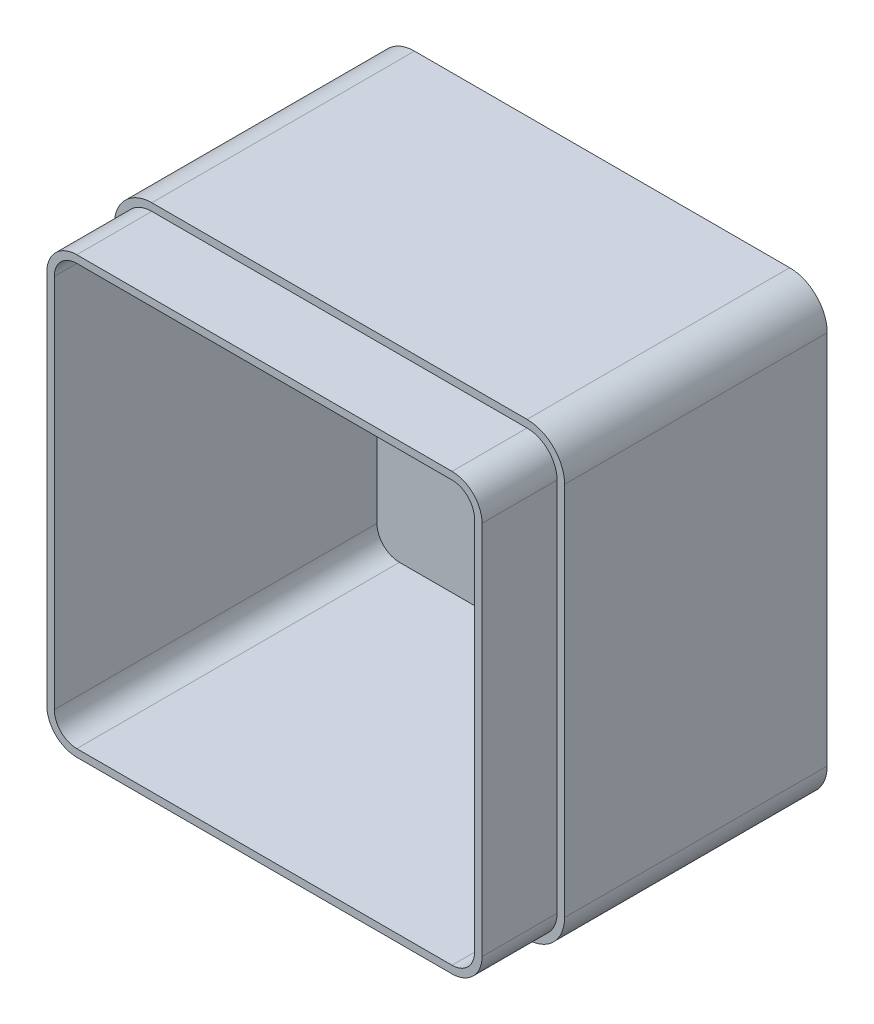
ISO-10303-21;
HEADER;
FILE_DESCRIPTION(('STEP AP214'),'2;1');
FILE_NAME('part.step','',(''),(''),'','','');
FILE_SCHEMA(('AUTOMOTIVE_DESIGN { 1 0 10303 214 1 1 1 1 }'));
ENDSEC;
DATA;
#1=APPLICATION_CONTEXT('core data for automotive mechanical design processes');
#2=APPLICATION_PROTOCOL_DEFINITION('international standard','automotive_design',2000,#1);
#3=PRODUCT_CONTEXT('',#1,'mechanical');
#4=PRODUCT('Part','Part','',(#3));
#5=PRODUCT_RELATED_PRODUCT_CATEGORY('part','',(#4));
#6=PRODUCT_DEFINITION_FORMATION('','',#4);
#7=PRODUCT_DEFINITION_CONTEXT('part definition',#1,'design');
#8=PRODUCT_DEFINITION('design','',#6,#7);
#9=PRODUCT_DEFINITION_SHAPE('','',#8);
#10=(LENGTH_UNIT() NAMED_UNIT(*) SI_UNIT(.MILLI.,.METRE.));
#11=(NAMED_UNIT(*) PLANE_ANGLE_UNIT() SI_UNIT($,.RADIAN.));
#12=(NAMED_UNIT(*) SI_UNIT($,.STERADIAN.) SOLID_ANGLE_UNIT());
#13=UNCERTAINTY_MEASURE_WITH_UNIT(LENGTH_MEASURE(1.E-05),#10,'distance_accuracy_value','');
#14=(GEOMETRIC_REPRESENTATION_CONTEXT(3) GLOBAL_UNCERTAINTY_ASSIGNED_CONTEXT((#13)) GLOBAL_UNIT_ASSIGNED_CONTEXT((#10,
#11,#12)) REPRESENTATION_CONTEXT('',''));
#15=CARTESIAN_POINT('',(0.,0.,0.));
#16=DIRECTION('',(0.,0.,1.));
#17=DIRECTION('',(1.,0.,0.));
#18=AXIS2_PLACEMENT_3D('',#15,#16,#17);
#19=CARTESIAN_POINT('',(0.,0.,90.));
#20=DIRECTION('',(0.,0.,1.));
#21=DIRECTION('',(1.,0.,0.));
#22=AXIS2_PLACEMENT_3D('',#19,#20,#21);
#23=PLANE('',#22);
#24=DIRECTION('',(-1.,0.,0.));
#25=VECTOR('',#24,1.);
#26=CARTESIAN_POINT('',(60.,56.,90.));
#27=LINE('',#26,#25);
#28=CARTESIAN_POINT('',(50.,56.,90.));
#29=VERTEX_POINT('',#28);
#30=CARTESIAN_POINT('',(-50.,56.,90.));
#31=VERTEX_POINT('',#30);
#32=EDGE_CURVE('E332',#29,#31,#27,.T.);
#33=ORIENTED_EDGE('',*,*,#32,.F.);
#34=CARTESIAN_POINT('',(50.,50.,90.));
#35=DIRECTION('',(0.,0.,1.));
#36=DIRECTION('',(1.,0.,0.));
#37=AXIS2_PLACEMENT_3D('',#34,#35,#36);
#38=CIRCLE('',#37,6.);
#39=CARTESIAN_POINT('',(56.,50.,90.));
#40=VERTEX_POINT('',#39);
#41=EDGE_CURVE('E380',#40,#29,#38,.T.);
#42=ORIENTED_EDGE('',*,*,#41,.F.);
#43=DIRECTION('',(0.,1.,0.));
#44=VECTOR('',#43,1.);
#45=CARTESIAN_POINT('',(56.,-60.,90.));
#46=LINE('',#45,#44);
#47=CARTESIAN_POINT('',(56.,-50.,90.));
#48=VERTEX_POINT('',#47);
#49=EDGE_CURVE('E392',#48,#40,#46,.T.);
#50=ORIENTED_EDGE('',*,*,#49,.F.);
#51=CARTESIAN_POINT('',(50.,-50.,90.));
#52=DIRECTION('',(0.,0.,1.));
#53=DIRECTION('',(1.,0.,0.));
#54=AXIS2_PLACEMENT_3D('',#51,#52,#53);
#55=CIRCLE('',#54,6.);
#56=CARTESIAN_POINT('',(50.,-56.,90.));
#57=VERTEX_POINT('',#56);
#58=EDGE_CURVE('E388',#57,#48,#55,.T.);
#59=ORIENTED_EDGE('',*,*,#58,.F.);
#60=DIRECTION('',(1.,0.,0.));
#61=VECTOR('',#60,1.);
#62=CARTESIAN_POINT('',(60.,-56.,90.));
#63=LINE('',#62,#61);
#64=CARTESIAN_POINT('',(-50.,-56.,90.));
#65=VERTEX_POINT('',#64);
#66=EDGE_CURVE('E384',#65,#57,#63,.T.);
#67=ORIENTED_EDGE('',*,*,#66,.F.);
#68=CARTESIAN_POINT('',(-50.,-50.,90.));
#69=DIRECTION('',(0.,0.,1.));
#70=DIRECTION('',(1.,0.,0.));
#71=AXIS2_PLACEMENT_3D('',#68,#69,#70);
#72=CIRCLE('',#71,6.);
#73=CARTESIAN_POINT('',(-56.,-50.,90.));
#74=VERTEX_POINT('',#73);
#75=EDGE_CURVE('E385',#74,#65,#72,.T.);
#76=ORIENTED_EDGE('',*,*,#75,.F.);
#77=DIRECTION('',(0.,-1.,0.));
#78=VECTOR('',#77,1.);
#79=CARTESIAN_POINT('',(-56.,-60.,90.));
#80=LINE('',#79,#78);
#81=CARTESIAN_POINT('',(-56.,50.,90.));
#82=VERTEX_POINT('',#81);
#83=EDGE_CURVE('E342',#82,#74,#80,.T.);
#84=ORIENTED_EDGE('',*,*,#83,.F.);
#85=CARTESIAN_POINT('',(-50.,50.,90.));
#86=DIRECTION('',(0.,0.,1.));
#87=DIRECTION('',(1.,0.,0.));
#88=AXIS2_PLACEMENT_3D('',#85,#86,#87);
#89=CIRCLE('',#88,6.);
#90=EDGE_CURVE('E365',#31,#82,#89,.T.);
#91=ORIENTED_EDGE('',*,*,#90,.F.);
#92=EDGE_LOOP('',(#33,#42,#50,#59,#67,#76,#84,#91));
#93=FACE_BOUND('',#92,.T.);
#94=DIRECTION('',(0.,1.,0.));
#95=VECTOR('',#94,1.);
#96=CARTESIAN_POINT('',(58.,-50.,90.));
#97=LINE('',#96,#95);
#98=CARTESIAN_POINT('',(58.,-50.,90.));
#99=VERTEX_POINT('',#98);
#100=CARTESIAN_POINT('',(58.,50.,90.));
#101=VERTEX_POINT('',#100);
#102=EDGE_CURVE('E228',#99,#101,#97,.T.);
#103=ORIENTED_EDGE('',*,*,#102,.T.);
#104=CARTESIAN_POINT('',(50.,50.,90.));
#105=DIRECTION('',(0.,0.,1.));
#106=DIRECTION('',(1.,0.,0.));
#107=AXIS2_PLACEMENT_3D('',#104,#105,#106);
#108=CIRCLE('',#107,8.);
#109=CARTESIAN_POINT('',(50.,58.,90.));
#110=VERTEX_POINT('',#109);
#111=EDGE_CURVE('E255',#101,#110,#108,.T.);
#112=ORIENTED_EDGE('',*,*,#111,.T.);
#113=DIRECTION('',(-1.,0.,0.));
#114=VECTOR('',#113,1.);
#115=CARTESIAN_POINT('',(50.,58.,90.));
#116=LINE('',#115,#114);
#117=CARTESIAN_POINT('',(-50.,58.,90.));
#118=VERTEX_POINT('',#117);
#119=EDGE_CURVE('E205',#110,#118,#116,.T.);
#120=ORIENTED_EDGE('',*,*,#119,.T.);
#121=CARTESIAN_POINT('',(-50.,50.,90.));
#122=DIRECTION('',(0.,0.,1.));
#123=DIRECTION('',(1.,0.,0.));
#124=AXIS2_PLACEMENT_3D('',#121,#122,#123);
#125=CIRCLE('',#124,8.);
#126=CARTESIAN_POINT('',(-58.,50.,90.));
#127=VERTEX_POINT('',#126);
#128=EDGE_CURVE('E54',#118,#127,#125,.T.);
#129=ORIENTED_EDGE('',*,*,#128,.T.);
#130=DIRECTION('',(0.,-1.,0.));
#131=VECTOR('',#130,1.);
#132=CARTESIAN_POINT('',(-58.,50.,90.));
#133=LINE('',#132,#131);
#134=CARTESIAN_POINT('',(-58.,-50.,90.));
#135=VERTEX_POINT('',#134);
#136=EDGE_CURVE('E262',#127,#135,#133,.T.);
#137=ORIENTED_EDGE('',*,*,#136,.T.);
#138=CARTESIAN_POINT('',(-50.,-50.,90.));
#139=DIRECTION('',(0.,0.,1.));
#140=DIRECTION('',(1.,0.,0.));
#141=AXIS2_PLACEMENT_3D('',#138,#139,#140);
#142=CIRCLE('',#141,8.00000000000001);
#143=CARTESIAN_POINT('',(-50.,-58.,90.));
#144=VERTEX_POINT('',#143);
#145=EDGE_CURVE('E266',#135,#144,#142,.T.);
#146=ORIENTED_EDGE('',*,*,#145,.T.);
#147=DIRECTION('',(1.,0.,0.));
#148=VECTOR('',#147,1.);
#149=CARTESIAN_POINT('',(-50.,-58.,90.));
#150=LINE('',#149,#148);
#151=CARTESIAN_POINT('',(50.,-58.,90.));
#152=VERTEX_POINT('',#151);
#153=EDGE_CURVE('E270',#144,#152,#150,.T.);
#154=ORIENTED_EDGE('',*,*,#153,.T.);
#155=CARTESIAN_POINT('',(50.,-50.,90.));
#156=DIRECTION('',(0.,0.,1.));
#157=DIRECTION('',(1.,0.,0.));
#158=AXIS2_PLACEMENT_3D('',#155,#156,#157);
#159=CIRCLE('',#158,8.00000000000001);
#160=EDGE_CURVE('E232',#152,#99,#159,.T.);
#161=ORIENTED_EDGE('',*,*,#160,.T.);
#162=EDGE_LOOP('',(#103,#112,#120,#129,#137,#146,#154,#161));
#163=FACE_BOUND('',#162,.T.);
#164=ADVANCED_FACE('F38',(#93,#163),#23,.T.);
#165=CARTESIAN_POINT('',(-56.,-60.,90.));
#166=DIRECTION('',(1.,0.,0.));
#167=DIRECTION('',(0.,0.,-1.));
#168=AXIS2_PLACEMENT_3D('',#165,#166,#167);
#169=PLANE('',#168);
#170=ORIENTED_EDGE('',*,*,#83,.T.);
#171=DIRECTION('',(0.,0.,-1.));
#172=VECTOR('',#171,1.);
#173=CARTESIAN_POINT('',(-56.,-50.,90.));
#174=LINE('',#173,#172);
#175=CARTESIAN_POINT('',(-56.,-50.,4.));
#176=VERTEX_POINT('',#175);
#177=EDGE_CURVE('E325',#176,#74,#174,.F.);
#178=ORIENTED_EDGE('',*,*,#177,.F.);
#179=DIRECTION('',(0.,-1.,0.));
#180=VECTOR('',#179,1.);
#181=CARTESIAN_POINT('',(-56.,-60.,4.));
#182=LINE('',#181,#180);
#183=CARTESIAN_POINT('',(-56.,50.,4.));
#184=VERTEX_POINT('',#183);
#185=EDGE_CURVE('E319',#184,#176,#182,.T.);
#186=ORIENTED_EDGE('',*,*,#185,.F.);
#187=DIRECTION('',(0.,0.,-1.));
#188=VECTOR('',#187,1.);
#189=CARTESIAN_POINT('',(-56.,50.,90.));
#190=LINE('',#189,#188);
#191=EDGE_CURVE('E320',#82,#184,#190,.T.);
#192=ORIENTED_EDGE('',*,*,#191,.F.);
#193=EDGE_LOOP('',(#170,#178,#186,#192));
#194=FACE_BOUND('',#193,.T.);
#195=ADVANCED_FACE('F504',(#194),#169,.T.);
#196=CARTESIAN_POINT('',(60.,-56.,90.));
#197=DIRECTION('',(0.,1.,0.));
#198=DIRECTION('',(-1.,0.,0.));
#199=AXIS2_PLACEMENT_3D('',#196,#197,#198);
#200=PLANE('',#199);
#201=ORIENTED_EDGE('',*,*,#66,.T.);
#202=DIRECTION('',(0.,0.,1.));
#203=VECTOR('',#202,1.);
#204=CARTESIAN_POINT('',(50.,-56.,90.));
#205=LINE('',#204,#203);
#206=CARTESIAN_POINT('',(50.,-56.,4.));
#207=VERTEX_POINT('',#206);
#208=EDGE_CURVE('E362',#207,#57,#205,.T.);
#209=ORIENTED_EDGE('',*,*,#208,.F.);
#210=DIRECTION('',(1.,0.,0.));
#211=VECTOR('',#210,1.);
#212=CARTESIAN_POINT('',(60.,-56.,4.));
#213=LINE('',#212,#211);
#214=CARTESIAN_POINT('',(-50.,-56.,4.));
#215=VERTEX_POINT('',#214);
#216=EDGE_CURVE('E329',#215,#207,#213,.T.);
#217=ORIENTED_EDGE('',*,*,#216,.F.);
#218=DIRECTION('',(0.,0.,1.));
#219=VECTOR('',#218,1.);
#220=CARTESIAN_POINT('',(-50.,-56.,90.));
#221=LINE('',#220,#219);
#222=EDGE_CURVE('E357',#65,#215,#221,.F.);
#223=ORIENTED_EDGE('',*,*,#222,.F.);
#224=EDGE_LOOP('',(#201,#209,#217,#223));
#225=FACE_BOUND('',#224,.T.);
#226=ADVANCED_FACE('F509',(#225),#200,.T.);
#227=CARTESIAN_POINT('',(56.,-60.,90.));
#228=DIRECTION('',(-1.,0.,0.));
#229=DIRECTION('',(0.,0.,1.));
#230=AXIS2_PLACEMENT_3D('',#227,#228,#229);
#231=PLANE('',#230);
#232=ORIENTED_EDGE('',*,*,#49,.T.);
#233=DIRECTION('',(0.,0.,1.));
#234=VECTOR('',#233,1.);
#235=CARTESIAN_POINT('',(56.,50.,90.));
#236=LINE('',#235,#234);
#237=CARTESIAN_POINT('',(56.,50.,4.));
#238=VERTEX_POINT('',#237);
#239=EDGE_CURVE('E361',#238,#40,#236,.T.);
#240=ORIENTED_EDGE('',*,*,#239,.F.);
#241=DIRECTION('',(0.,1.,0.));
#242=VECTOR('',#241,1.);
#243=CARTESIAN_POINT('',(56.,-60.,4.));
#244=LINE('',#243,#242);
#245=CARTESIAN_POINT('',(56.,-50.,4.));
#246=VERTEX_POINT('',#245);
#247=EDGE_CURVE('E343',#246,#238,#244,.T.);
#248=ORIENTED_EDGE('',*,*,#247,.F.);
#249=DIRECTION('',(0.,0.,1.));
#250=VECTOR('',#249,1.);
#251=CARTESIAN_POINT('',(56.,-50.,90.));
#252=LINE('',#251,#250);
#253=EDGE_CURVE('E366',#48,#246,#252,.F.);
#254=ORIENTED_EDGE('',*,*,#253,.F.);
#255=EDGE_LOOP('',(#232,#240,#248,#254));
#256=FACE_BOUND('',#255,.T.);
#257=ADVANCED_FACE('F538',(#256),#231,.T.);
#258=CARTESIAN_POINT('',(60.,56.,90.));
#259=DIRECTION('',(0.,-1.,0.));
#260=DIRECTION('',(1.,0.,0.));
#261=AXIS2_PLACEMENT_3D('',#258,#259,#260);
#262=PLANE('',#261);
#263=DIRECTION('',(-1.,0.,0.));
#264=VECTOR('',#263,1.);
#265=CARTESIAN_POINT('',(60.,56.,4.));
#266=LINE('',#265,#264);
#267=CARTESIAN_POINT('',(50.,56.,4.));
#268=VERTEX_POINT('',#267);
#269=CARTESIAN_POINT('',(-50.,56.,4.));
#270=VERTEX_POINT('',#269);
#271=EDGE_CURVE('E338',#268,#270,#266,.T.);
#272=ORIENTED_EDGE('',*,*,#271,.F.);
#273=DIRECTION('',(0.,0.,1.));
#274=VECTOR('',#273,1.);
#275=CARTESIAN_POINT('',(50.,56.,90.));
#276=LINE('',#275,#274);
#277=EDGE_CURVE('E336',#29,#268,#276,.F.);
#278=ORIENTED_EDGE('',*,*,#277,.F.);
#279=ORIENTED_EDGE('',*,*,#32,.T.);
#280=DIRECTION('',(0.,0.,1.));
#281=VECTOR('',#280,1.);
#282=CARTESIAN_POINT('',(-50.,56.,90.));
#283=LINE('',#282,#281);
#284=EDGE_CURVE('E377',#270,#31,#283,.T.);
#285=ORIENTED_EDGE('',*,*,#284,.F.);
#286=EDGE_LOOP('',(#272,#278,#279,#285));
#287=FACE_BOUND('',#286,.T.);
#288=ADVANCED_FACE('F534',(#287),#262,.T.);
#289=CARTESIAN_POINT('',(0.,0.,4.));
#290=DIRECTION('',(0.,0.,1.));
#291=DIRECTION('',(1.,0.,0.));
#292=AXIS2_PLACEMENT_3D('',#289,#290,#291);
#293=PLANE('',#292);
#294=ORIENTED_EDGE('',*,*,#185,.T.);
#295=CARTESIAN_POINT('',(-50.,-50.,4.));
#296=DIRECTION('',(0.,0.,1.));
#297=DIRECTION('',(1.,0.,0.));
#298=AXIS2_PLACEMENT_3D('',#295,#296,#297);
#299=CIRCLE('',#298,6.);
#300=EDGE_CURVE('E337',#215,#176,#299,.F.);
#301=ORIENTED_EDGE('',*,*,#300,.F.);
#302=ORIENTED_EDGE('',*,*,#216,.T.);
#303=CARTESIAN_POINT('',(50.,-50.,4.));
#304=DIRECTION('',(0.,0.,1.));
#305=DIRECTION('',(1.,0.,0.));
#306=AXIS2_PLACEMENT_3D('',#303,#304,#305);
#307=CIRCLE('',#306,6.);
#308=EDGE_CURVE('E346',#246,#207,#307,.F.);
#309=ORIENTED_EDGE('',*,*,#308,.F.);
#310=ORIENTED_EDGE('',*,*,#247,.T.);
#311=CARTESIAN_POINT('',(50.,50.,4.));
#312=DIRECTION('',(0.,0.,1.));
#313=DIRECTION('',(1.,0.,0.));
#314=AXIS2_PLACEMENT_3D('',#311,#312,#313);
#315=CIRCLE('',#314,6.);
#316=EDGE_CURVE('E324',#268,#238,#315,.F.);
#317=ORIENTED_EDGE('',*,*,#316,.F.);
#318=ORIENTED_EDGE('',*,*,#271,.T.);
#319=CARTESIAN_POINT('',(-50.,50.,4.));
#320=DIRECTION('',(0.,0.,1.));
#321=DIRECTION('',(1.,0.,0.));
#322=AXIS2_PLACEMENT_3D('',#319,#320,#321);
#323=CIRCLE('',#322,6.);
#324=EDGE_CURVE('E333',#184,#270,#323,.F.);
#325=ORIENTED_EDGE('',*,*,#324,.F.);
#326=EDGE_LOOP('',(#294,#301,#302,#309,#310,#317,#318,#325));
#327=FACE_BOUND('',#326,.T.);
#328=ADVANCED_FACE('F530',(#327),#293,.T.);
#329=CARTESIAN_POINT('',(-50.,50.,90.));
#330=DIRECTION('',(0.,0.,-1.));
#331=DIRECTION('',(-1.,0.,0.));
#332=AXIS2_PLACEMENT_3D('',#329,#330,#331);
#333=CYLINDRICAL_SURFACE('',#332,6.);
#334=ORIENTED_EDGE('',*,*,#90,.T.);
#335=ORIENTED_EDGE('',*,*,#191,.T.);
#336=ORIENTED_EDGE('',*,*,#324,.T.);
#337=ORIENTED_EDGE('',*,*,#284,.T.);
#338=EDGE_LOOP('',(#334,#335,#336,#337));
#339=FACE_BOUND('',#338,.T.);
#340=ADVANCED_FACE('F526',(#339),#333,.F.);
#341=CARTESIAN_POINT('',(-50.,-50.,90.));
#342=DIRECTION('',(0.,0.,-1.));
#343=DIRECTION('',(-1.,0.,0.));
#344=AXIS2_PLACEMENT_3D('',#341,#342,#343);
#345=CYLINDRICAL_SURFACE('',#344,6.);
#346=ORIENTED_EDGE('',*,*,#75,.T.);
#347=ORIENTED_EDGE('',*,*,#222,.T.);
#348=ORIENTED_EDGE('',*,*,#300,.T.);
#349=ORIENTED_EDGE('',*,*,#177,.T.);
#350=EDGE_LOOP('',(#346,#347,#348,#349));
#351=FACE_BOUND('',#350,.T.);
#352=ADVANCED_FACE('F522',(#351),#345,.F.);
#353=CARTESIAN_POINT('',(50.,-50.,90.));
#354=DIRECTION('',(0.,0.,-1.));
#355=DIRECTION('',(-1.,0.,0.));
#356=AXIS2_PLACEMENT_3D('',#353,#354,#355);
#357=CYLINDRICAL_SURFACE('',#356,6.);
#358=ORIENTED_EDGE('',*,*,#58,.T.);
#359=ORIENTED_EDGE('',*,*,#253,.T.);
#360=ORIENTED_EDGE('',*,*,#308,.T.);
#361=ORIENTED_EDGE('',*,*,#208,.T.);
#362=EDGE_LOOP('',(#358,#359,#360,#361));
#363=FACE_BOUND('',#362,.T.);
#364=ADVANCED_FACE('F518',(#363),#357,.F.);
#365=CARTESIAN_POINT('',(50.,50.,90.));
#366=DIRECTION('',(0.,0.,-1.));
#367=DIRECTION('',(-1.,0.,0.));
#368=AXIS2_PLACEMENT_3D('',#365,#366,#367);
#369=CYLINDRICAL_SURFACE('',#368,6.);
#370=ORIENTED_EDGE('',*,*,#41,.T.);
#371=ORIENTED_EDGE('',*,*,#277,.T.);
#372=ORIENTED_EDGE('',*,*,#316,.T.);
#373=ORIENTED_EDGE('',*,*,#239,.T.);
#374=EDGE_LOOP('',(#370,#371,#372,#373));
#375=FACE_BOUND('',#374,.T.);
#376=ADVANCED_FACE('F515',(#375),#369,.F.);
#377=CARTESIAN_POINT('',(50.,50.,70.));
#378=DIRECTION('',(0.,0.,1.));
#379=DIRECTION('',(1.,0.,0.));
#380=AXIS2_PLACEMENT_3D('',#377,#378,#379);
#381=PLANE('',#380);
#382=DIRECTION('',(0.,1.,0.));
#383=VECTOR('',#382,1.);
#384=CARTESIAN_POINT('',(58.,-50.,70.));
#385=LINE('',#384,#383);
#386=CARTESIAN_POINT('',(58.,-50.,70.));
#387=VERTEX_POINT('',#386);
#388=CARTESIAN_POINT('',(58.,50.,70.));
#389=VERTEX_POINT('',#388);
#390=EDGE_CURVE('E212',#387,#389,#385,.T.);
#391=ORIENTED_EDGE('',*,*,#390,.F.);
#392=CARTESIAN_POINT('',(50.,-50.,70.));
#393=DIRECTION('',(0.,0.,1.));
#394=DIRECTION('',(1.,0.,0.));
#395=AXIS2_PLACEMENT_3D('',#392,#393,#394);
#396=CIRCLE('',#395,8.00000000000001);
#397=CARTESIAN_POINT('',(50.,-58.,70.));
#398=VERTEX_POINT('',#397);
#399=EDGE_CURVE('E249',#398,#387,#396,.T.);
#400=ORIENTED_EDGE('',*,*,#399,.F.);
#401=DIRECTION('',(1.,0.,0.));
#402=VECTOR('',#401,1.);
#403=CARTESIAN_POINT('',(-50.,-58.,70.));
#404=LINE('',#403,#402);
#405=CARTESIAN_POINT('',(-50.,-58.,70.));
#406=VERTEX_POINT('',#405);
#407=EDGE_CURVE('E245',#406,#398,#404,.T.);
#408=ORIENTED_EDGE('',*,*,#407,.F.);
#409=CARTESIAN_POINT('',(-50.,-50.,70.));
#410=DIRECTION('',(0.,0.,1.));
#411=DIRECTION('',(1.,0.,0.));
#412=AXIS2_PLACEMENT_3D('',#409,#410,#411);
#413=CIRCLE('',#412,8.00000000000001);
#414=CARTESIAN_POINT('',(-58.,-50.,70.));
#415=VERTEX_POINT('',#414);
#416=EDGE_CURVE('E241',#415,#406,#413,.T.);
#417=ORIENTED_EDGE('',*,*,#416,.F.);
#418=DIRECTION('',(0.,-1.,0.));
#419=VECTOR('',#418,1.);
#420=CARTESIAN_POINT('',(-58.,50.,70.));
#421=LINE('',#420,#419);
#422=CARTESIAN_POINT('',(-58.,50.,70.));
#423=VERTEX_POINT('',#422);
#424=EDGE_CURVE('E237',#423,#415,#421,.T.);
#425=ORIENTED_EDGE('',*,*,#424,.F.);
#426=CARTESIAN_POINT('',(-50.,50.,70.));
#427=DIRECTION('',(0.,0.,1.));
#428=DIRECTION('',(1.,0.,0.));
#429=AXIS2_PLACEMENT_3D('',#426,#427,#428);
#430=CIRCLE('',#429,8.);
#431=CARTESIAN_POINT('',(-50.,58.,70.));
#432=VERTEX_POINT('',#431);
#433=EDGE_CURVE('E222',#432,#423,#430,.T.);
#434=ORIENTED_EDGE('',*,*,#433,.F.);
#435=DIRECTION('',(-1.,0.,0.));
#436=VECTOR('',#435,1.);
#437=CARTESIAN_POINT('',(50.,58.,70.));
#438=LINE('',#437,#436);
#439=CARTESIAN_POINT('',(50.,58.,70.));
#440=VERTEX_POINT('',#439);
#441=EDGE_CURVE('E203',#440,#432,#438,.T.);
#442=ORIENTED_EDGE('',*,*,#441,.F.);
#443=CARTESIAN_POINT('',(50.,50.,70.));
#444=DIRECTION('',(0.,0.,1.));
#445=DIRECTION('',(1.,0.,0.));
#446=AXIS2_PLACEMENT_3D('',#443,#444,#445);
#447=CIRCLE('',#446,8.);
#448=EDGE_CURVE('E218',#389,#440,#447,.T.);
#449=ORIENTED_EDGE('',*,*,#448,.F.);
#450=EDGE_LOOP('',(#391,#400,#408,#417,#425,#434,#442,#449));
#451=FACE_BOUND('',#450,.T.);
#452=CARTESIAN_POINT('',(50.,50.,70.));
#453=DIRECTION('',(0.,0.,1.));
#454=DIRECTION('',(1.,0.,0.));
#455=AXIS2_PLACEMENT_3D('',#452,#453,#454);
#456=CIRCLE('',#455,10.);
#457=CARTESIAN_POINT('',(60.,50.,70.));
#458=VERTEX_POINT('',#457);
#459=CARTESIAN_POINT('',(50.,60.,70.));
#460=VERTEX_POINT('',#459);
#461=EDGE_CURVE('E279',#458,#460,#456,.T.);
#462=ORIENTED_EDGE('',*,*,#461,.T.);
#463=DIRECTION('',(-1.,0.,0.));
#464=VECTOR('',#463,1.);
#465=CARTESIAN_POINT('',(50.,60.,70.));
#466=LINE('',#465,#464);
#467=CARTESIAN_POINT('',(-50.,60.,70.));
#468=VERTEX_POINT('',#467);
#469=EDGE_CURVE('E299',#460,#468,#466,.T.);
#470=ORIENTED_EDGE('',*,*,#469,.T.);
#471=CARTESIAN_POINT('',(-50.,50.,70.));
#472=DIRECTION('',(0.,0.,1.));
#473=DIRECTION('',(1.,0.,0.));
#474=AXIS2_PLACEMENT_3D('',#471,#472,#473);
#475=CIRCLE('',#474,9.99999999999999);
#476=CARTESIAN_POINT('',(-60.,50.,70.));
#477=VERTEX_POINT('',#476);
#478=EDGE_CURVE('E302',#468,#477,#475,.T.);
#479=ORIENTED_EDGE('',*,*,#478,.T.);
#480=DIRECTION('',(0.,-1.,0.));
#481=VECTOR('',#480,1.);
#482=CARTESIAN_POINT('',(-60.,50.,70.));
#483=LINE('',#482,#481);
#484=CARTESIAN_POINT('',(-60.,-50.,70.));
#485=VERTEX_POINT('',#484);
#486=EDGE_CURVE('E305',#477,#485,#483,.T.);
#487=ORIENTED_EDGE('',*,*,#486,.T.);
#488=CARTESIAN_POINT('',(-50.,-50.,70.));
#489=DIRECTION('',(0.,0.,1.));
#490=DIRECTION('',(1.,0.,0.));
#491=AXIS2_PLACEMENT_3D('',#488,#489,#490);
#492=CIRCLE('',#491,10.);
#493=CARTESIAN_POINT('',(-50.,-60.,70.));
#494=VERTEX_POINT('',#493);
#495=EDGE_CURVE('E308',#485,#494,#492,.T.);
#496=ORIENTED_EDGE('',*,*,#495,.T.);
#497=DIRECTION('',(1.,0.,0.));
#498=VECTOR('',#497,1.);
#499=CARTESIAN_POINT('',(-50.,-60.,70.));
#500=LINE('',#499,#498);
#501=CARTESIAN_POINT('',(50.,-60.,70.));
#502=VERTEX_POINT('',#501);
#503=EDGE_CURVE('E311',#494,#502,#500,.T.);
#504=ORIENTED_EDGE('',*,*,#503,.T.);
#505=CARTESIAN_POINT('',(50.,-50.,70.));
#506=DIRECTION('',(0.,0.,1.));
#507=DIRECTION('',(1.,0.,0.));
#508=AXIS2_PLACEMENT_3D('',#505,#506,#507);
#509=CIRCLE('',#508,10.);
#510=CARTESIAN_POINT('',(60.,-50.,70.));
#511=VERTEX_POINT('',#510);
#512=EDGE_CURVE('E314',#502,#511,#509,.T.);
#513=ORIENTED_EDGE('',*,*,#512,.T.);
#514=DIRECTION('',(0.,1.,0.));
#515=VECTOR('',#514,1.);
#516=CARTESIAN_POINT('',(60.,-50.,70.));
#517=LINE('',#516,#515);
#518=EDGE_CURVE('E62',#511,#458,#517,.T.);
#519=ORIENTED_EDGE('',*,*,#518,.T.);
#520=EDGE_LOOP('',(#462,#470,#479,#487,#496,#504,#513,#519));
#521=FACE_BOUND('',#520,.T.);
#522=ADVANCED_FACE('F217',(#451,#521),#381,.T.);
#523=CARTESIAN_POINT('',(50.,50.,70.));
#524=DIRECTION('',(0.,0.,1.));
#525=DIRECTION('',(1.,0.,0.));
#526=AXIS2_PLACEMENT_3D('',#523,#524,#525);
#527=CYLINDRICAL_SURFACE('',#526,8.);
#528=ORIENTED_EDGE('',*,*,#111,.F.);
#529=DIRECTION('',(0.,0.,1.));
#530=VECTOR('',#529,1.);
#531=CARTESIAN_POINT('',(58.,50.,70.));
#532=LINE('',#531,#530);
#533=EDGE_CURVE('E226',#389,#101,#532,.T.);
#534=ORIENTED_EDGE('',*,*,#533,.F.);
#535=ORIENTED_EDGE('',*,*,#448,.T.);
#536=DIRECTION('',(0.,0.,1.));
#537=VECTOR('',#536,1.);
#538=CARTESIAN_POINT('',(50.,58.,70.));
#539=LINE('',#538,#537);
#540=EDGE_CURVE('E200',#440,#110,#539,.T.);
#541=ORIENTED_EDGE('',*,*,#540,.T.);
#542=EDGE_LOOP('',(#528,#534,#535,#541));
#543=FACE_BOUND('',#542,.T.);
#544=ADVANCED_FACE('F225',(#543),#527,.T.);
#545=CARTESIAN_POINT('',(58.,-50.,70.));
#546=DIRECTION('',(1.,0.,0.));
#547=DIRECTION('',(0.,0.,-1.));
#548=AXIS2_PLACEMENT_3D('',#545,#546,#547);
#549=PLANE('',#548);
#550=ORIENTED_EDGE('',*,*,#102,.F.);
#551=DIRECTION('',(0.,0.,1.));
#552=VECTOR('',#551,1.);
#553=CARTESIAN_POINT('',(58.,-50.,70.));
#554=LINE('',#553,#552);
#555=EDGE_CURVE('E280',#387,#99,#554,.T.);
#556=ORIENTED_EDGE('',*,*,#555,.F.);
#557=ORIENTED_EDGE('',*,*,#390,.T.);
#558=ORIENTED_EDGE('',*,*,#533,.T.);
#559=EDGE_LOOP('',(#550,#556,#557,#558));
#560=FACE_BOUND('',#559,.T.);
#561=ADVANCED_FACE('F549',(#560),#549,.T.);
#562=CARTESIAN_POINT('',(50.,-50.,70.));
#563=DIRECTION('',(0.,0.,1.));
#564=DIRECTION('',(1.,0.,0.));
#565=AXIS2_PLACEMENT_3D('',#562,#563,#564);
#566=CYLINDRICAL_SURFACE('',#565,8.00000000000001);
#567=ORIENTED_EDGE('',*,*,#160,.F.);
#568=DIRECTION('',(0.,0.,1.));
#569=VECTOR('',#568,1.);
#570=CARTESIAN_POINT('',(50.,-58.,70.));
#571=LINE('',#570,#569);
#572=EDGE_CURVE('E283',#398,#152,#571,.T.);
#573=ORIENTED_EDGE('',*,*,#572,.F.);
#574=ORIENTED_EDGE('',*,*,#399,.T.);
#575=ORIENTED_EDGE('',*,*,#555,.T.);
#576=EDGE_LOOP('',(#567,#573,#574,#575));
#577=FACE_BOUND('',#576,.T.);
#578=ADVANCED_FACE('F564',(#577),#566,.T.);
#579=CARTESIAN_POINT('',(-50.,-58.,70.));
#580=DIRECTION('',(0.,-1.,0.));
#581=DIRECTION('',(1.,0.,0.));
#582=AXIS2_PLACEMENT_3D('',#579,#580,#581);
#583=PLANE('',#582);
#584=ORIENTED_EDGE('',*,*,#153,.F.);
#585=DIRECTION('',(0.,0.,1.));
#586=VECTOR('',#585,1.);
#587=CARTESIAN_POINT('',(-50.,-58.,70.));
#588=LINE('',#587,#586);
#589=EDGE_CURVE('E286',#406,#144,#588,.T.);
#590=ORIENTED_EDGE('',*,*,#589,.F.);
#591=ORIENTED_EDGE('',*,*,#407,.T.);
#592=ORIENTED_EDGE('',*,*,#572,.T.);
#593=EDGE_LOOP('',(#584,#590,#591,#592));
#594=FACE_BOUND('',#593,.T.);
#595=ADVANCED_FACE('F560',(#594),#583,.T.);
#596=CARTESIAN_POINT('',(-50.,-50.,70.));
#597=DIRECTION('',(0.,0.,1.));
#598=DIRECTION('',(1.,0.,0.));
#599=AXIS2_PLACEMENT_3D('',#596,#597,#598);
#600=CYLINDRICAL_SURFACE('',#599,8.00000000000001);
#601=ORIENTED_EDGE('',*,*,#145,.F.);
#602=DIRECTION('',(0.,0.,1.));
#603=VECTOR('',#602,1.);
#604=CARTESIAN_POINT('',(-58.,-50.,70.));
#605=LINE('',#604,#603);
#606=EDGE_CURVE('E289',#415,#135,#605,.T.);
#607=ORIENTED_EDGE('',*,*,#606,.F.);
#608=ORIENTED_EDGE('',*,*,#416,.T.);
#609=ORIENTED_EDGE('',*,*,#589,.T.);
#610=EDGE_LOOP('',(#601,#607,#608,#609));
#611=FACE_BOUND('',#610,.T.);
#612=ADVANCED_FACE('F556',(#611),#600,.T.);
#613=CARTESIAN_POINT('',(-58.,50.,70.));
#614=DIRECTION('',(-1.,0.,0.));
#615=DIRECTION('',(0.,0.,1.));
#616=AXIS2_PLACEMENT_3D('',#613,#614,#615);
#617=PLANE('',#616);
#618=ORIENTED_EDGE('',*,*,#136,.F.);
#619=DIRECTION('',(0.,0.,1.));
#620=VECTOR('',#619,1.);
#621=CARTESIAN_POINT('',(-58.,50.,70.));
#622=LINE('',#621,#620);
#623=EDGE_CURVE('E292',#423,#127,#622,.T.);
#624=ORIENTED_EDGE('',*,*,#623,.F.);
#625=ORIENTED_EDGE('',*,*,#424,.T.);
#626=ORIENTED_EDGE('',*,*,#606,.T.);
#627=EDGE_LOOP('',(#618,#624,#625,#626));
#628=FACE_BOUND('',#627,.T.);
#629=ADVANCED_FACE('F553',(#628),#617,.T.);
#630=CARTESIAN_POINT('',(-50.,50.,70.));
#631=DIRECTION('',(0.,0.,1.));
#632=DIRECTION('',(1.,0.,0.));
#633=AXIS2_PLACEMENT_3D('',#630,#631,#632);
#634=CYLINDRICAL_SURFACE('',#633,8.);
#635=ORIENTED_EDGE('',*,*,#128,.F.);
#636=DIRECTION('',(0.,0.,1.));
#637=VECTOR('',#636,1.);
#638=CARTESIAN_POINT('',(-50.,58.,70.));
#639=LINE('',#638,#637);
#640=EDGE_CURVE('E211',#432,#118,#639,.T.);
#641=ORIENTED_EDGE('',*,*,#640,.F.);
#642=ORIENTED_EDGE('',*,*,#433,.T.);
#643=ORIENTED_EDGE('',*,*,#623,.T.);
#644=EDGE_LOOP('',(#635,#641,#642,#643));
#645=FACE_BOUND('',#644,.T.);
#646=ADVANCED_FACE('F499',(#645),#634,.T.);
#647=CARTESIAN_POINT('',(50.,58.,70.));
#648=DIRECTION('',(0.,1.,0.));
#649=DIRECTION('',(0.,0.,1.));
#650=AXIS2_PLACEMENT_3D('',#647,#648,#649);
#651=PLANE('',#650);
#652=ORIENTED_EDGE('',*,*,#119,.F.);
#653=ORIENTED_EDGE('',*,*,#540,.F.);
#654=ORIENTED_EDGE('',*,*,#441,.T.);
#655=ORIENTED_EDGE('',*,*,#640,.T.);
#656=EDGE_LOOP('',(#652,#653,#654,#655));
#657=FACE_BOUND('',#656,.T.);
#658=ADVANCED_FACE('F202',(#657),#651,.T.);
#659=CARTESIAN_POINT('',(0.,0.,0.));
#660=DIRECTION('',(0.,0.,1.));
#661=DIRECTION('',(1.,0.,0.));
#662=AXIS2_PLACEMENT_3D('',#659,#660,#661);
#663=PLANE('',#662);
#664=DIRECTION('',(0.,-1.,0.));
#665=VECTOR('',#664,1.);
#666=CARTESIAN_POINT('',(-60.,-60.,0.));
#667=LINE('',#666,#665);
#668=CARTESIAN_POINT('',(-60.,50.,0.));
#669=VERTEX_POINT('',#668);
#670=CARTESIAN_POINT('',(-60.,-50.,0.));
#671=VERTEX_POINT('',#670);
#672=EDGE_CURVE('E370',#669,#671,#667,.T.);
#673=ORIENTED_EDGE('',*,*,#672,.F.);
#674=CARTESIAN_POINT('',(-50.,50.,0.));
#675=DIRECTION('',(0.,0.,1.));
#676=DIRECTION('',(1.,0.,0.));
#677=AXIS2_PLACEMENT_3D('',#674,#675,#676);
#678=CIRCLE('',#677,10.);
#679=CARTESIAN_POINT('',(-50.,60.,0.));
#680=VERTEX_POINT('',#679);
#681=EDGE_CURVE('E435',#669,#680,#678,.F.);
#682=ORIENTED_EDGE('',*,*,#681,.T.);
#683=DIRECTION('',(-1.,0.,0.));
#684=VECTOR('',#683,1.);
#685=CARTESIAN_POINT('',(60.,60.,0.));
#686=LINE('',#685,#684);
#687=CARTESIAN_POINT('',(50.,60.,0.));
#688=VERTEX_POINT('',#687);
#689=EDGE_CURVE('E415',#688,#680,#686,.T.);
#690=ORIENTED_EDGE('',*,*,#689,.F.);
#691=CARTESIAN_POINT('',(50.,50.,0.));
#692=DIRECTION('',(0.,0.,1.));
#693=DIRECTION('',(1.,0.,0.));
#694=AXIS2_PLACEMENT_3D('',#691,#692,#693);
#695=CIRCLE('',#694,10.);
#696=CARTESIAN_POINT('',(60.,50.,0.));
#697=VERTEX_POINT('',#696);
#698=EDGE_CURVE('E426',#688,#697,#695,.F.);
#699=ORIENTED_EDGE('',*,*,#698,.T.);
#700=DIRECTION('',(0.,1.,0.));
#701=VECTOR('',#700,1.);
#702=CARTESIAN_POINT('',(60.,-60.,0.));
#703=LINE('',#702,#701);
#704=CARTESIAN_POINT('',(60.,-50.,0.));
#705=VERTEX_POINT('',#704);
#706=EDGE_CURVE('E411',#705,#697,#703,.T.);
#707=ORIENTED_EDGE('',*,*,#706,.F.);
#708=CARTESIAN_POINT('',(50.,-50.,0.));
#709=DIRECTION('',(0.,0.,1.));
#710=DIRECTION('',(1.,0.,0.));
#711=AXIS2_PLACEMENT_3D('',#708,#709,#710);
#712=CIRCLE('',#711,10.);
#713=CARTESIAN_POINT('',(50.,-60.,0.));
#714=VERTEX_POINT('',#713);
#715=EDGE_CURVE('E429',#705,#714,#712,.F.);
#716=ORIENTED_EDGE('',*,*,#715,.T.);
#717=DIRECTION('',(1.,0.,0.));
#718=VECTOR('',#717,1.);
#719=CARTESIAN_POINT('',(60.,-60.,0.));
#720=LINE('',#719,#718);
#721=CARTESIAN_POINT('',(-50.,-60.,0.));
#722=VERTEX_POINT('',#721);
#723=EDGE_CURVE('E407',#722,#714,#720,.T.);
#724=ORIENTED_EDGE('',*,*,#723,.F.);
#725=CARTESIAN_POINT('',(-50.,-50.,0.));
#726=DIRECTION('',(0.,0.,1.));
#727=DIRECTION('',(1.,0.,0.));
#728=AXIS2_PLACEMENT_3D('',#725,#726,#727);
#729=CIRCLE('',#728,10.);
#730=EDGE_CURVE('E432',#722,#671,#729,.F.);
#731=ORIENTED_EDGE('',*,*,#730,.T.);
#732=EDGE_LOOP('',(#673,#682,#690,#699,#707,#716,#724,#731));
#733=FACE_BOUND('',#732,.T.);
#734=ADVANCED_FACE('F491',(#733),#663,.F.);
#735=CARTESIAN_POINT('',(-50.,50.,90.));
#736=DIRECTION('',(0.,0.,-1.));
#737=DIRECTION('',(-1.,0.,0.));
#738=AXIS2_PLACEMENT_3D('',#735,#736,#737);
#739=CYLINDRICAL_SURFACE('',#738,10.);
#740=DIRECTION('',(0.,0.,-1.));
#741=VECTOR('',#740,1.);
#742=CARTESIAN_POINT('',(-60.,50.,90.));
#743=LINE('',#742,#741);
#744=EDGE_CURVE('E423',#477,#669,#743,.T.);
#745=ORIENTED_EDGE('',*,*,#744,.F.);
#746=ORIENTED_EDGE('',*,*,#478,.F.);
#747=DIRECTION('',(0.,0.,-1.));
#748=VECTOR('',#747,1.);
#749=CARTESIAN_POINT('',(-50.,60.,90.));
#750=LINE('',#749,#748);
#751=EDGE_CURVE('E441',#680,#468,#750,.F.);
#752=ORIENTED_EDGE('',*,*,#751,.F.);
#753=ORIENTED_EDGE('',*,*,#681,.F.);
#754=EDGE_LOOP('',(#745,#746,#752,#753));
#755=FACE_BOUND('',#754,.T.);
#756=ADVANCED_FACE('F470',(#755),#739,.T.);
#757=CARTESIAN_POINT('',(50.,50.,90.));
#758=DIRECTION('',(0.,0.,-1.));
#759=DIRECTION('',(-1.,0.,0.));
#760=AXIS2_PLACEMENT_3D('',#757,#758,#759);
#761=CYLINDRICAL_SURFACE('',#760,10.);
#762=DIRECTION('',(0.,0.,-1.));
#763=VECTOR('',#762,1.);
#764=CARTESIAN_POINT('',(50.,60.,90.));
#765=LINE('',#764,#763);
#766=EDGE_CURVE('E438',#460,#688,#765,.T.);
#767=ORIENTED_EDGE('',*,*,#766,.F.);
#768=ORIENTED_EDGE('',*,*,#461,.F.);
#769=DIRECTION('',(0.,0.,-1.));
#770=VECTOR('',#769,1.);
#771=CARTESIAN_POINT('',(60.,50.,90.));
#772=LINE('',#771,#770);
#773=EDGE_CURVE('E47',#697,#458,#772,.F.);
#774=ORIENTED_EDGE('',*,*,#773,.F.);
#775=ORIENTED_EDGE('',*,*,#698,.F.);
#776=EDGE_LOOP('',(#767,#768,#774,#775));
#777=FACE_BOUND('',#776,.T.);
#778=ADVANCED_FACE('F40',(#777),#761,.T.);
#779=CARTESIAN_POINT('',(60.,60.,90.));
#780=DIRECTION('',(0.,-1.,0.));
#781=DIRECTION('',(1.,0.,0.));
#782=AXIS2_PLACEMENT_3D('',#779,#780,#781);
#783=PLANE('',#782);
#784=ORIENTED_EDGE('',*,*,#469,.F.);
#785=ORIENTED_EDGE('',*,*,#766,.T.);
#786=ORIENTED_EDGE('',*,*,#689,.T.);
#787=ORIENTED_EDGE('',*,*,#751,.T.);
#788=EDGE_LOOP('',(#784,#785,#786,#787));
#789=FACE_BOUND('',#788,.T.);
#790=ADVANCED_FACE('F465',(#789),#783,.F.);
#791=CARTESIAN_POINT('',(50.,-50.,90.));
#792=DIRECTION('',(0.,0.,-1.));
#793=DIRECTION('',(-1.,0.,0.));
#794=AXIS2_PLACEMENT_3D('',#791,#792,#793);
#795=CYLINDRICAL_SURFACE('',#794,10.);
#796=DIRECTION('',(0.,0.,-1.));
#797=VECTOR('',#796,1.);
#798=CARTESIAN_POINT('',(60.,-50.,90.));
#799=LINE('',#798,#797);
#800=EDGE_CURVE('E11',#511,#705,#799,.T.);
#801=ORIENTED_EDGE('',*,*,#800,.F.);
#802=ORIENTED_EDGE('',*,*,#512,.F.);
#803=DIRECTION('',(0.,0.,-1.));
#804=VECTOR('',#803,1.);
#805=CARTESIAN_POINT('',(50.,-60.,90.));
#806=LINE('',#805,#804);
#807=EDGE_CURVE('E445',#714,#502,#806,.F.);
#808=ORIENTED_EDGE('',*,*,#807,.F.);
#809=ORIENTED_EDGE('',*,*,#715,.F.);
#810=EDGE_LOOP('',(#801,#802,#808,#809));
#811=FACE_BOUND('',#810,.T.);
#812=ADVANCED_FACE('F489',(#811),#795,.T.);
#813=CARTESIAN_POINT('',(60.,-60.,90.));
#814=DIRECTION('',(-1.,0.,0.));
#815=DIRECTION('',(0.,0.,1.));
#816=AXIS2_PLACEMENT_3D('',#813,#814,#815);
#817=PLANE('',#816);
#818=ORIENTED_EDGE('',*,*,#518,.F.);
#819=ORIENTED_EDGE('',*,*,#800,.T.);
#820=ORIENTED_EDGE('',*,*,#706,.T.);
#821=ORIENTED_EDGE('',*,*,#773,.T.);
#822=EDGE_LOOP('',(#818,#819,#820,#821));
#823=FACE_BOUND('',#822,.T.);
#824=ADVANCED_FACE('F455',(#823),#817,.F.);
#825=CARTESIAN_POINT('',(-50.,-50.,90.));
#826=DIRECTION('',(0.,0.,-1.));
#827=DIRECTION('',(-1.,0.,0.));
#828=AXIS2_PLACEMENT_3D('',#825,#826,#827);
#829=CYLINDRICAL_SURFACE('',#828,10.);
#830=DIRECTION('',(0.,0.,-1.));
#831=VECTOR('',#830,1.);
#832=CARTESIAN_POINT('',(-50.,-60.,90.));
#833=LINE('',#832,#831);
#834=EDGE_CURVE('E449',#494,#722,#833,.T.);
#835=ORIENTED_EDGE('',*,*,#834,.F.);
#836=ORIENTED_EDGE('',*,*,#495,.F.);
#837=DIRECTION('',(0.,0.,-1.));
#838=VECTOR('',#837,1.);
#839=CARTESIAN_POINT('',(-60.,-50.,90.));
#840=LINE('',#839,#838);
#841=EDGE_CURVE('E419',#671,#485,#840,.F.);
#842=ORIENTED_EDGE('',*,*,#841,.F.);
#843=ORIENTED_EDGE('',*,*,#730,.F.);
#844=EDGE_LOOP('',(#835,#836,#842,#843));
#845=FACE_BOUND('',#844,.T.);
#846=ADVANCED_FACE('F480',(#845),#829,.T.);
#847=CARTESIAN_POINT('',(60.,-60.,90.));
#848=DIRECTION('',(0.,1.,0.));
#849=DIRECTION('',(-1.,0.,0.));
#850=AXIS2_PLACEMENT_3D('',#847,#848,#849);
#851=PLANE('',#850);
#852=ORIENTED_EDGE('',*,*,#503,.F.);
#853=ORIENTED_EDGE('',*,*,#834,.T.);
#854=ORIENTED_EDGE('',*,*,#723,.T.);
#855=ORIENTED_EDGE('',*,*,#807,.T.);
#856=EDGE_LOOP('',(#852,#853,#854,#855));
#857=FACE_BOUND('',#856,.T.);
#858=ADVANCED_FACE('F485',(#857),#851,.F.);
#859=CARTESIAN_POINT('',(-60.,-60.,90.));
#860=DIRECTION('',(1.,0.,0.));
#861=DIRECTION('',(0.,0.,-1.));
#862=AXIS2_PLACEMENT_3D('',#859,#860,#861);
#863=PLANE('',#862);
#864=ORIENTED_EDGE('',*,*,#486,.F.);
#865=ORIENTED_EDGE('',*,*,#744,.T.);
#866=ORIENTED_EDGE('',*,*,#672,.T.);
#867=ORIENTED_EDGE('',*,*,#841,.T.);
#868=EDGE_LOOP('',(#864,#865,#866,#867));
#869=FACE_BOUND('',#868,.T.);
#870=ADVANCED_FACE('F475',(#869),#863,.F.);
#871=CLOSED_SHELL('',(#164,#195,#226,#257,#288,#328,#340,#352,#364,#376,#522,#544,#561,#578,
#595,#612,#629,#646,#658,#734,#756,#778,#790,#812,#824,#846,#858,#870));
#872=MANIFOLD_SOLID_BREP('B2',#871);
#873=ADVANCED_BREP_SHAPE_REPRESENTATION('',(#18,#872),#14);
#874=SHAPE_DEFINITION_REPRESENTATION(#9,#873);
ENDSEC;
END-ISO-10303-21;
